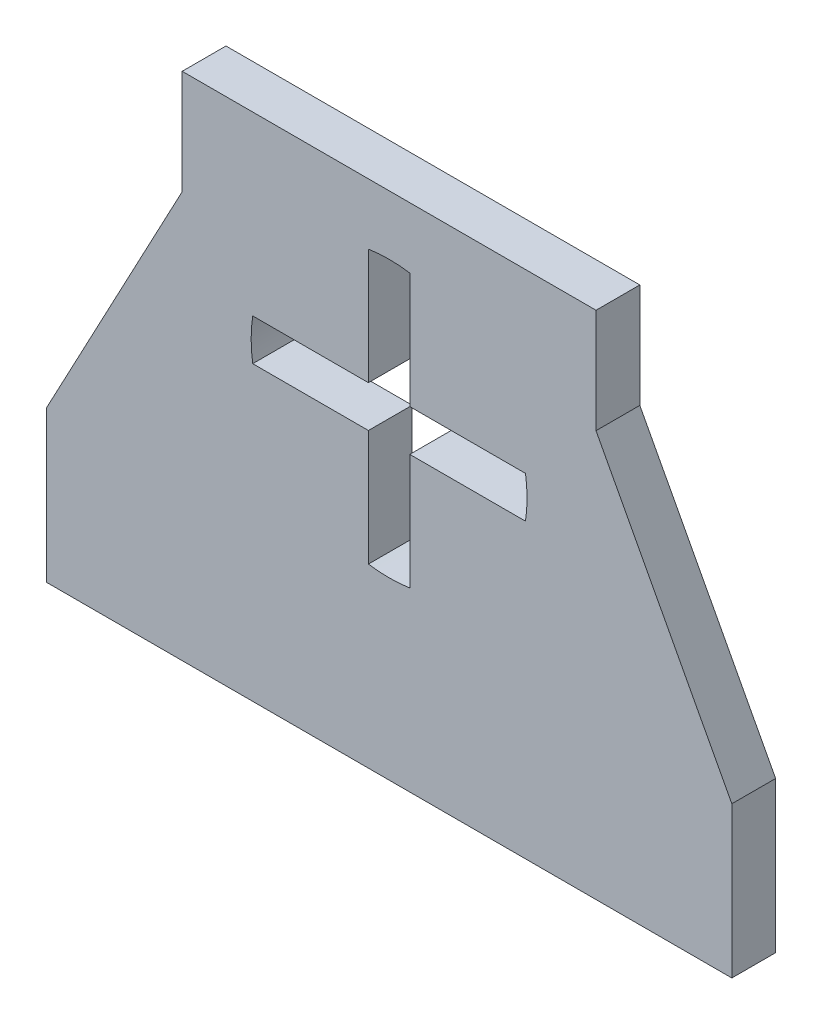
ISO-10303-21;
HEADER;
FILE_DESCRIPTION(('STEP AP214'),'2;1');
FILE_NAME('part.step','',(''),(''),'','','');
FILE_SCHEMA(('AUTOMOTIVE_DESIGN { 1 0 10303 214 1 1 1 1 }'));
ENDSEC;
DATA;
#1=APPLICATION_CONTEXT('core data for automotive mechanical design processes');
#2=APPLICATION_PROTOCOL_DEFINITION('international standard','automotive_design',2000,#1);
#3=PRODUCT_CONTEXT('',#1,'mechanical');
#4=PRODUCT('Part','Part','',(#3));
#5=PRODUCT_RELATED_PRODUCT_CATEGORY('part','',(#4));
#6=PRODUCT_DEFINITION_FORMATION('','',#4);
#7=PRODUCT_DEFINITION_CONTEXT('part definition',#1,'design');
#8=PRODUCT_DEFINITION('design','',#6,#7);
#9=PRODUCT_DEFINITION_SHAPE('','',#8);
#10=(LENGTH_UNIT() NAMED_UNIT(*) SI_UNIT(.MILLI.,.METRE.));
#11=(NAMED_UNIT(*) PLANE_ANGLE_UNIT() SI_UNIT($,.RADIAN.));
#12=(NAMED_UNIT(*) SI_UNIT($,.STERADIAN.) SOLID_ANGLE_UNIT());
#13=UNCERTAINTY_MEASURE_WITH_UNIT(LENGTH_MEASURE(1.E-05),#10,'distance_accuracy_value','');
#14=(GEOMETRIC_REPRESENTATION_CONTEXT(3) GLOBAL_UNCERTAINTY_ASSIGNED_CONTEXT((#13)) GLOBAL_UNIT_ASSIGNED_CONTEXT((#10,
#11,#12)) REPRESENTATION_CONTEXT('',''));
#15=CARTESIAN_POINT('',(0.,0.,0.));
#16=DIRECTION('',(0.,0.,1.));
#17=DIRECTION('',(1.,0.,0.));
#18=AXIS2_PLACEMENT_3D('',#15,#16,#17);
#19=CARTESIAN_POINT('',(0.,0.,3.175));
#20=DIRECTION('',(0.,0.,1.));
#21=DIRECTION('',(1.,0.,0.));
#22=AXIS2_PLACEMENT_3D('',#19,#20,#21);
#23=PLANE('',#22);
#24=DIRECTION('',(0.469783108849391,0.882781870361983,0.));
#25=VECTOR('',#24,1.);
#26=CARTESIAN_POINT('',(-18.2990938927911,9.73808537159615,3.175));
#27=LINE('',#26,#25);
#28=CARTESIAN_POINT('',(-24.845,-2.5625,3.175));
#29=VERTEX_POINT('',#28);
#30=CARTESIAN_POINT('',(-15.,15.9375,3.175));
#31=VERTEX_POINT('',#30);
#32=EDGE_CURVE('E139',#29,#31,#27,.T.);
#33=ORIENTED_EDGE('',*,*,#32,.F.);
#34=DIRECTION('',(0.,-1.,0.));
#35=VECTOR('',#34,1.);
#36=CARTESIAN_POINT('',(-24.845,13.5,3.175));
#37=LINE('',#36,#35);
#38=CARTESIAN_POINT('',(-24.845,-13.5,3.175));
#39=VERTEX_POINT('',#38);
#40=EDGE_CURVE('E169',#29,#39,#37,.T.);
#41=ORIENTED_EDGE('',*,*,#40,.T.);
#42=DIRECTION('',(1.,0.,0.));
#43=VECTOR('',#42,1.);
#44=CARTESIAN_POINT('',(-24.845,-13.5,3.175));
#45=LINE('',#44,#43);
#46=CARTESIAN_POINT('',(24.845,-13.5,3.175));
#47=VERTEX_POINT('',#46);
#48=EDGE_CURVE('E57',#39,#47,#45,.T.);
#49=ORIENTED_EDGE('',*,*,#48,.T.);
#50=DIRECTION('',(0.,1.,0.));
#51=VECTOR('',#50,1.);
#52=CARTESIAN_POINT('',(24.845,13.5,3.175));
#53=LINE('',#52,#51);
#54=CARTESIAN_POINT('',(24.845,-2.5625,3.175));
#55=VERTEX_POINT('',#54);
#56=EDGE_CURVE('E107',#47,#55,#53,.T.);
#57=ORIENTED_EDGE('',*,*,#56,.T.);
#58=DIRECTION('',(-0.469783108849391,0.882781870361983,0.));
#59=VECTOR('',#58,1.);
#60=CARTESIAN_POINT('',(18.2990938927911,9.73808537159615,3.175));
#61=LINE('',#60,#59);
#62=CARTESIAN_POINT('',(15.,15.9375,3.175));
#63=VERTEX_POINT('',#62);
#64=EDGE_CURVE('E75',#55,#63,#61,.T.);
#65=ORIENTED_EDGE('',*,*,#64,.T.);
#66=DIRECTION('',(0.,-1.,0.));
#67=VECTOR('',#66,1.);
#68=CARTESIAN_POINT('',(15.,0.,3.175));
#69=LINE('',#68,#67);
#70=CARTESIAN_POINT('',(15.,23.5,3.175));
#71=VERTEX_POINT('',#70);
#72=EDGE_CURVE('E142',#71,#63,#69,.T.);
#73=ORIENTED_EDGE('',*,*,#72,.F.);
#74=DIRECTION('',(1.,0.,0.));
#75=VECTOR('',#74,1.);
#76=CARTESIAN_POINT('',(0.,23.5,3.175));
#77=LINE('',#76,#75);
#78=CARTESIAN_POINT('',(-15.,23.5,3.175));
#79=VERTEX_POINT('',#78);
#80=EDGE_CURVE('E125',#79,#71,#77,.T.);
#81=ORIENTED_EDGE('',*,*,#80,.F.);
#82=DIRECTION('',(0.,-1.,0.));
#83=VECTOR('',#82,1.);
#84=CARTESIAN_POINT('',(-15.,0.,3.175));
#85=LINE('',#84,#83);
#86=EDGE_CURVE('E135',#79,#31,#85,.T.);
#87=ORIENTED_EDGE('',*,*,#86,.T.);
#88=EDGE_LOOP('',(#33,#41,#49,#57,#65,#73,#81,#87));
#89=FACE_BOUND('',#88,.T.);
#90=DIRECTION('',(1.,0.,0.));
#91=VECTOR('',#90,1.);
#92=CARTESIAN_POINT('',(0.,7.7,3.175));
#93=LINE('',#92,#91);
#94=CARTESIAN_POINT('',(-9.8868599666426,7.7,3.175));
#95=VERTEX_POINT('',#94);
#96=CARTESIAN_POINT('',(-1.5,7.7,3.175));
#97=VERTEX_POINT('',#96);
#98=EDGE_CURVE('E261',#95,#97,#93,.T.);
#99=ORIENTED_EDGE('',*,*,#98,.F.);
#100=CARTESIAN_POINT('',(0.,9.2,3.175));
#101=DIRECTION('',(0.,0.,-1.));
#102=DIRECTION('',(-1.,0.,0.));
#103=AXIS2_PLACEMENT_3D('',#100,#101,#102);
#104=CIRCLE('',#103,10.);
#105=CARTESIAN_POINT('',(-9.8868599666426,10.7,3.175));
#106=VERTEX_POINT('',#105);
#107=EDGE_CURVE('E151',#95,#106,#104,.T.);
#108=ORIENTED_EDGE('',*,*,#107,.T.);
#109=DIRECTION('',(1.,0.,0.));
#110=VECTOR('',#109,1.);
#111=CARTESIAN_POINT('',(0.,10.7,3.175));
#112=LINE('',#111,#110);
#113=CARTESIAN_POINT('',(-1.5,10.7,3.175));
#114=VERTEX_POINT('',#113);
#115=EDGE_CURVE('E202',#106,#114,#112,.T.);
#116=ORIENTED_EDGE('',*,*,#115,.T.);
#117=DIRECTION('',(0.,-1.,0.));
#118=VECTOR('',#117,1.);
#119=CARTESIAN_POINT('',(-1.5,0.,3.175));
#120=LINE('',#119,#118);
#121=CARTESIAN_POINT('',(-1.5,19.0868599666426,3.175));
#122=VERTEX_POINT('',#121);
#123=EDGE_CURVE('E237',#122,#114,#120,.T.);
#124=ORIENTED_EDGE('',*,*,#123,.F.);
#125=CARTESIAN_POINT('',(1.5,19.0868599666426,3.175));
#126=VERTEX_POINT('',#125);
#127=EDGE_CURVE('E194',#122,#126,#104,.T.);
#128=ORIENTED_EDGE('',*,*,#127,.T.);
#129=DIRECTION('',(0.,-1.,0.));
#130=VECTOR('',#129,1.);
#131=CARTESIAN_POINT('',(1.50000000000001,0.,3.175));
#132=LINE('',#131,#130);
#133=CARTESIAN_POINT('',(1.50000000000001,10.7,3.175));
#134=VERTEX_POINT('',#133);
#135=EDGE_CURVE('E276',#126,#134,#132,.T.);
#136=ORIENTED_EDGE('',*,*,#135,.T.);
#137=DIRECTION('',(-1.,0.,0.));
#138=VECTOR('',#137,1.);
#139=CARTESIAN_POINT('',(0.,10.7,3.175));
#140=LINE('',#139,#138);
#141=CARTESIAN_POINT('',(9.88685996664259,10.7,3.175));
#142=VERTEX_POINT('',#141);
#143=EDGE_CURVE('E273',#142,#134,#140,.T.);
#144=ORIENTED_EDGE('',*,*,#143,.F.);
#145=CARTESIAN_POINT('',(9.88685996664259,7.7,3.175));
#146=VERTEX_POINT('',#145);
#147=EDGE_CURVE('E197',#142,#146,#104,.T.);
#148=ORIENTED_EDGE('',*,*,#147,.T.);
#149=DIRECTION('',(-1.,0.,0.));
#150=VECTOR('',#149,1.);
#151=CARTESIAN_POINT('',(0.,7.7,3.175));
#152=LINE('',#151,#150);
#153=CARTESIAN_POINT('',(1.50000000000001,7.7,3.175));
#154=VERTEX_POINT('',#153);
#155=EDGE_CURVE('E270',#146,#154,#152,.T.);
#156=ORIENTED_EDGE('',*,*,#155,.T.);
#157=DIRECTION('',(0.,1.,0.));
#158=VECTOR('',#157,1.);
#159=CARTESIAN_POINT('',(1.50000000000001,0.,3.175));
#160=LINE('',#159,#158);
#161=CARTESIAN_POINT('',(1.50000000000001,-0.686859966642592,3.175));
#162=VERTEX_POINT('',#161);
#163=EDGE_CURVE('E267',#162,#154,#160,.T.);
#164=ORIENTED_EDGE('',*,*,#163,.F.);
#165=CARTESIAN_POINT('',(-1.5,-0.686859966642594,3.175));
#166=VERTEX_POINT('',#165);
#167=EDGE_CURVE('E301',#162,#166,#104,.T.);
#168=ORIENTED_EDGE('',*,*,#167,.T.);
#169=DIRECTION('',(0.,1.,0.));
#170=VECTOR('',#169,1.);
#171=CARTESIAN_POINT('',(-1.5,0.,3.175));
#172=LINE('',#171,#170);
#173=EDGE_CURVE('E264',#166,#97,#172,.T.);
#174=ORIENTED_EDGE('',*,*,#173,.T.);
#175=EDGE_LOOP('',(#99,#108,#116,#124,#128,#136,#144,#148,#156,#164,#168,#174));
#176=FACE_BOUND('',#175,.T.);
#177=ADVANCED_FACE('F40',(#89,#176),#23,.T.);
#178=CARTESIAN_POINT('',(0.,0.,0.));
#179=DIRECTION('',(0.,0.,1.));
#180=DIRECTION('',(1.,0.,0.));
#181=AXIS2_PLACEMENT_3D('',#178,#179,#180);
#182=PLANE('',#181);
#183=DIRECTION('',(0.,-1.,0.));
#184=VECTOR('',#183,1.);
#185=CARTESIAN_POINT('',(-24.845,13.5,0.));
#186=LINE('',#185,#184);
#187=CARTESIAN_POINT('',(-24.845,-2.5625,0.));
#188=VERTEX_POINT('',#187);
#189=CARTESIAN_POINT('',(-24.845,-13.5,0.));
#190=VERTEX_POINT('',#189);
#191=EDGE_CURVE('E68',#188,#190,#186,.T.);
#192=ORIENTED_EDGE('',*,*,#191,.F.);
#193=DIRECTION('',(0.469783108849391,0.882781870361983,0.));
#194=VECTOR('',#193,1.);
#195=CARTESIAN_POINT('',(-18.2990938927911,9.73808537159615,0.));
#196=LINE('',#195,#194);
#197=CARTESIAN_POINT('',(-15.,15.9375,0.));
#198=VERTEX_POINT('',#197);
#199=EDGE_CURVE('E150',#188,#198,#196,.T.);
#200=ORIENTED_EDGE('',*,*,#199,.T.);
#201=DIRECTION('',(0.,-1.,0.));
#202=VECTOR('',#201,1.);
#203=CARTESIAN_POINT('',(-15.,0.,0.));
#204=LINE('',#203,#202);
#205=CARTESIAN_POINT('',(-15.,23.5,0.));
#206=VERTEX_POINT('',#205);
#207=EDGE_CURVE('E154',#206,#198,#204,.T.);
#208=ORIENTED_EDGE('',*,*,#207,.F.);
#209=DIRECTION('',(1.,0.,0.));
#210=VECTOR('',#209,1.);
#211=CARTESIAN_POINT('',(0.,23.5,0.));
#212=LINE('',#211,#210);
#213=CARTESIAN_POINT('',(15.,23.5,0.));
#214=VERTEX_POINT('',#213);
#215=EDGE_CURVE('E127',#206,#214,#212,.T.);
#216=ORIENTED_EDGE('',*,*,#215,.T.);
#217=DIRECTION('',(0.,-1.,0.));
#218=VECTOR('',#217,1.);
#219=CARTESIAN_POINT('',(15.,0.,0.));
#220=LINE('',#219,#218);
#221=CARTESIAN_POINT('',(15.,15.9375,0.));
#222=VERTEX_POINT('',#221);
#223=EDGE_CURVE('E157',#214,#222,#220,.T.);
#224=ORIENTED_EDGE('',*,*,#223,.T.);
#225=DIRECTION('',(-0.469783108849391,0.882781870361983,0.));
#226=VECTOR('',#225,1.);
#227=CARTESIAN_POINT('',(18.2990938927911,9.73808537159615,0.));
#228=LINE('',#227,#226);
#229=CARTESIAN_POINT('',(24.845,-2.5625,0.));
#230=VERTEX_POINT('',#229);
#231=EDGE_CURVE('E148',#230,#222,#228,.T.);
#232=ORIENTED_EDGE('',*,*,#231,.F.);
#233=DIRECTION('',(0.,1.,0.));
#234=VECTOR('',#233,1.);
#235=CARTESIAN_POINT('',(24.845,13.5,0.));
#236=LINE('',#235,#234);
#237=CARTESIAN_POINT('',(24.845,-13.5,0.));
#238=VERTEX_POINT('',#237);
#239=EDGE_CURVE('E161',#238,#230,#236,.T.);
#240=ORIENTED_EDGE('',*,*,#239,.F.);
#241=DIRECTION('',(1.,0.,0.));
#242=VECTOR('',#241,1.);
#243=CARTESIAN_POINT('',(-24.845,-13.5,0.));
#244=LINE('',#243,#242);
#245=EDGE_CURVE('E170',#190,#238,#244,.T.);
#246=ORIENTED_EDGE('',*,*,#245,.F.);
#247=EDGE_LOOP('',(#192,#200,#208,#216,#224,#232,#240,#246));
#248=FACE_BOUND('',#247,.T.);
#249=CARTESIAN_POINT('',(0.,9.2,0.));
#250=DIRECTION('',(0.,0.,-1.));
#251=DIRECTION('',(-1.,0.,0.));
#252=AXIS2_PLACEMENT_3D('',#249,#250,#251);
#253=CIRCLE('',#252,10.);
#254=CARTESIAN_POINT('',(-9.8868599666426,7.7,0.));
#255=VERTEX_POINT('',#254);
#256=CARTESIAN_POINT('',(-9.8868599666426,10.7,0.));
#257=VERTEX_POINT('',#256);
#258=EDGE_CURVE('E193',#255,#257,#253,.T.);
#259=ORIENTED_EDGE('',*,*,#258,.F.);
#260=DIRECTION('',(1.,0.,0.));
#261=VECTOR('',#260,1.);
#262=CARTESIAN_POINT('',(0.,7.7,0.));
#263=LINE('',#262,#261);
#264=CARTESIAN_POINT('',(-1.5,7.7,0.));
#265=VERTEX_POINT('',#264);
#266=EDGE_CURVE('E238',#255,#265,#263,.T.);
#267=ORIENTED_EDGE('',*,*,#266,.T.);
#268=DIRECTION('',(0.,1.,0.));
#269=VECTOR('',#268,1.);
#270=CARTESIAN_POINT('',(-1.5,0.,0.));
#271=LINE('',#270,#269);
#272=CARTESIAN_POINT('',(-1.5,-0.686859966642594,0.));
#273=VERTEX_POINT('',#272);
#274=EDGE_CURVE('E241',#273,#265,#271,.T.);
#275=ORIENTED_EDGE('',*,*,#274,.F.);
#276=CARTESIAN_POINT('',(1.50000000000001,-0.686859966642592,0.));
#277=VERTEX_POINT('',#276);
#278=EDGE_CURVE('E342',#277,#273,#253,.T.);
#279=ORIENTED_EDGE('',*,*,#278,.F.);
#280=DIRECTION('',(0.,1.,0.));
#281=VECTOR('',#280,1.);
#282=CARTESIAN_POINT('',(1.50000000000001,0.,0.));
#283=LINE('',#282,#281);
#284=CARTESIAN_POINT('',(1.50000000000001,7.7,0.));
#285=VERTEX_POINT('',#284);
#286=EDGE_CURVE('E244',#277,#285,#283,.T.);
#287=ORIENTED_EDGE('',*,*,#286,.T.);
#288=DIRECTION('',(-1.,0.,0.));
#289=VECTOR('',#288,1.);
#290=CARTESIAN_POINT('',(0.,7.7,0.));
#291=LINE('',#290,#289);
#292=CARTESIAN_POINT('',(9.88685996664259,7.7,0.));
#293=VERTEX_POINT('',#292);
#294=EDGE_CURVE('E247',#293,#285,#291,.T.);
#295=ORIENTED_EDGE('',*,*,#294,.F.);
#296=CARTESIAN_POINT('',(9.88685996664259,10.7,0.));
#297=VERTEX_POINT('',#296);
#298=EDGE_CURVE('E191',#297,#293,#253,.T.);
#299=ORIENTED_EDGE('',*,*,#298,.F.);
#300=DIRECTION('',(-1.,0.,0.));
#301=VECTOR('',#300,1.);
#302=CARTESIAN_POINT('',(0.,10.7,0.));
#303=LINE('',#302,#301);
#304=CARTESIAN_POINT('',(1.50000000000001,10.7,0.));
#305=VERTEX_POINT('',#304);
#306=EDGE_CURVE('E250',#297,#305,#303,.T.);
#307=ORIENTED_EDGE('',*,*,#306,.T.);
#308=DIRECTION('',(0.,-1.,0.));
#309=VECTOR('',#308,1.);
#310=CARTESIAN_POINT('',(1.50000000000001,0.,0.));
#311=LINE('',#310,#309);
#312=CARTESIAN_POINT('',(1.5,19.0868599666426,0.));
#313=VERTEX_POINT('',#312);
#314=EDGE_CURVE('E253',#313,#305,#311,.T.);
#315=ORIENTED_EDGE('',*,*,#314,.F.);
#316=CARTESIAN_POINT('',(-1.5,19.0868599666426,0.));
#317=VERTEX_POINT('',#316);
#318=EDGE_CURVE('E188',#317,#313,#253,.T.);
#319=ORIENTED_EDGE('',*,*,#318,.F.);
#320=DIRECTION('',(0.,-1.,0.));
#321=VECTOR('',#320,1.);
#322=CARTESIAN_POINT('',(-1.5,0.,0.));
#323=LINE('',#322,#321);
#324=CARTESIAN_POINT('',(-1.5,10.7,0.));
#325=VERTEX_POINT('',#324);
#326=EDGE_CURVE('E256',#317,#325,#323,.T.);
#327=ORIENTED_EDGE('',*,*,#326,.T.);
#328=DIRECTION('',(1.,0.,0.));
#329=VECTOR('',#328,1.);
#330=CARTESIAN_POINT('',(0.,10.7,0.));
#331=LINE('',#330,#329);
#332=EDGE_CURVE('E234',#257,#325,#331,.T.);
#333=ORIENTED_EDGE('',*,*,#332,.F.);
#334=EDGE_LOOP('',(#259,#267,#275,#279,#287,#295,#299,#307,#315,#319,#327,#333));
#335=FACE_BOUND('',#334,.T.);
#336=ADVANCED_FACE('F182',(#248,#335),#182,.F.);
#337=CARTESIAN_POINT('',(24.845,13.5,3.175));
#338=DIRECTION('',(-1.,0.,0.));
#339=DIRECTION('',(0.,0.,1.));
#340=AXIS2_PLACEMENT_3D('',#337,#338,#339);
#341=PLANE('',#340);
#342=ORIENTED_EDGE('',*,*,#239,.T.);
#343=DIRECTION('',(0.,0.,-1.));
#344=VECTOR('',#343,1.);
#345=CARTESIAN_POINT('',(24.845,-2.5625,3.175));
#346=LINE('',#345,#344);
#347=EDGE_CURVE('E144',#55,#230,#346,.T.);
#348=ORIENTED_EDGE('',*,*,#347,.F.);
#349=ORIENTED_EDGE('',*,*,#56,.F.);
#350=DIRECTION('',(0.,0.,-1.));
#351=VECTOR('',#350,1.);
#352=CARTESIAN_POINT('',(24.845,-13.5,3.175));
#353=LINE('',#352,#351);
#354=EDGE_CURVE('E49',#47,#238,#353,.T.);
#355=ORIENTED_EDGE('',*,*,#354,.T.);
#356=EDGE_LOOP('',(#342,#348,#349,#355));
#357=FACE_BOUND('',#356,.T.);
#358=ADVANCED_FACE('F42',(#357),#341,.F.);
#359=CARTESIAN_POINT('',(-24.845,13.5,3.175));
#360=DIRECTION('',(1.,0.,0.));
#361=DIRECTION('',(0.,0.,-1.));
#362=AXIS2_PLACEMENT_3D('',#359,#360,#361);
#363=PLANE('',#362);
#364=ORIENTED_EDGE('',*,*,#40,.F.);
#365=DIRECTION('',(0.,0.,-1.));
#366=VECTOR('',#365,1.);
#367=CARTESIAN_POINT('',(-24.845,-2.5625,3.175));
#368=LINE('',#367,#366);
#369=EDGE_CURVE('E164',#29,#188,#368,.T.);
#370=ORIENTED_EDGE('',*,*,#369,.T.);
#371=ORIENTED_EDGE('',*,*,#191,.T.);
#372=DIRECTION('',(0.,0.,-1.));
#373=VECTOR('',#372,1.);
#374=CARTESIAN_POINT('',(-24.845,-13.5,3.175));
#375=LINE('',#374,#373);
#376=EDGE_CURVE('E11',#39,#190,#375,.T.);
#377=ORIENTED_EDGE('',*,*,#376,.F.);
#378=EDGE_LOOP('',(#364,#370,#371,#377));
#379=FACE_BOUND('',#378,.T.);
#380=ADVANCED_FACE('F414',(#379),#363,.F.);
#381=CARTESIAN_POINT('',(-24.845,-13.5,3.175));
#382=DIRECTION('',(0.,1.,0.));
#383=DIRECTION('',(0.,0.,1.));
#384=AXIS2_PLACEMENT_3D('',#381,#382,#383);
#385=PLANE('',#384);
#386=ORIENTED_EDGE('',*,*,#245,.T.);
#387=ORIENTED_EDGE('',*,*,#354,.F.);
#388=ORIENTED_EDGE('',*,*,#48,.F.);
#389=ORIENTED_EDGE('',*,*,#376,.T.);
#390=EDGE_LOOP('',(#386,#387,#388,#389));
#391=FACE_BOUND('',#390,.T.);
#392=ADVANCED_FACE('F412',(#391),#385,.F.);
#393=CARTESIAN_POINT('',(18.2990938927911,9.73808537159615,3.175));
#394=DIRECTION('',(-0.882781870361983,-0.469783108849391,0.));
#395=DIRECTION('',(0.469783108849391,-0.882781870361983,0.));
#396=AXIS2_PLACEMENT_3D('',#393,#394,#395);
#397=PLANE('',#396);
#398=ORIENTED_EDGE('',*,*,#231,.T.);
#399=DIRECTION('',(0.,0.,-1.));
#400=VECTOR('',#399,1.);
#401=CARTESIAN_POINT('',(15.,15.9375,3.175));
#402=LINE('',#401,#400);
#403=EDGE_CURVE('E102',#63,#222,#402,.T.);
#404=ORIENTED_EDGE('',*,*,#403,.F.);
#405=ORIENTED_EDGE('',*,*,#64,.F.);
#406=ORIENTED_EDGE('',*,*,#347,.T.);
#407=EDGE_LOOP('',(#398,#404,#405,#406));
#408=FACE_BOUND('',#407,.T.);
#409=ADVANCED_FACE('F185',(#408),#397,.F.);
#410=CARTESIAN_POINT('',(15.,0.,3.175));
#411=DIRECTION('',(1.,0.,0.));
#412=DIRECTION('',(0.,0.,-1.));
#413=AXIS2_PLACEMENT_3D('',#410,#411,#412);
#414=PLANE('',#413);
#415=ORIENTED_EDGE('',*,*,#223,.F.);
#416=DIRECTION('',(0.,0.,-1.));
#417=VECTOR('',#416,1.);
#418=CARTESIAN_POINT('',(15.,23.5,3.175));
#419=LINE('',#418,#417);
#420=EDGE_CURVE('E131',#71,#214,#419,.T.);
#421=ORIENTED_EDGE('',*,*,#420,.F.);
#422=ORIENTED_EDGE('',*,*,#72,.T.);
#423=ORIENTED_EDGE('',*,*,#403,.T.);
#424=EDGE_LOOP('',(#415,#421,#422,#423));
#425=FACE_BOUND('',#424,.T.);
#426=ADVANCED_FACE('F422',(#425),#414,.T.);
#427=CARTESIAN_POINT('',(0.,23.5,3.175));
#428=DIRECTION('',(0.,1.,0.));
#429=DIRECTION('',(0.,0.,1.));
#430=AXIS2_PLACEMENT_3D('',#427,#428,#429);
#431=PLANE('',#430);
#432=ORIENTED_EDGE('',*,*,#215,.F.);
#433=DIRECTION('',(0.,0.,-1.));
#434=VECTOR('',#433,1.);
#435=CARTESIAN_POINT('',(-15.,23.5,3.175));
#436=LINE('',#435,#434);
#437=EDGE_CURVE('E121',#79,#206,#436,.T.);
#438=ORIENTED_EDGE('',*,*,#437,.F.);
#439=ORIENTED_EDGE('',*,*,#80,.T.);
#440=ORIENTED_EDGE('',*,*,#420,.T.);
#441=EDGE_LOOP('',(#432,#438,#439,#440));
#442=FACE_BOUND('',#441,.T.);
#443=ADVANCED_FACE('F123',(#442),#431,.T.);
#444=CARTESIAN_POINT('',(-15.,0.,3.175));
#445=DIRECTION('',(1.,0.,0.));
#446=DIRECTION('',(0.,0.,-1.));
#447=AXIS2_PLACEMENT_3D('',#444,#445,#446);
#448=PLANE('',#447);
#449=ORIENTED_EDGE('',*,*,#207,.T.);
#450=DIRECTION('',(0.,0.,-1.));
#451=VECTOR('',#450,1.);
#452=CARTESIAN_POINT('',(-15.,15.9375,3.175));
#453=LINE('',#452,#451);
#454=EDGE_CURVE('E132',#31,#198,#453,.T.);
#455=ORIENTED_EDGE('',*,*,#454,.F.);
#456=ORIENTED_EDGE('',*,*,#86,.F.);
#457=ORIENTED_EDGE('',*,*,#437,.T.);
#458=EDGE_LOOP('',(#449,#455,#456,#457));
#459=FACE_BOUND('',#458,.T.);
#460=ADVANCED_FACE('F136',(#459),#448,.F.);
#461=CARTESIAN_POINT('',(-18.2990938927911,9.73808537159615,3.175));
#462=DIRECTION('',(-0.882781870361983,0.469783108849391,0.));
#463=DIRECTION('',(-0.469783108849391,-0.882781870361983,0.));
#464=AXIS2_PLACEMENT_3D('',#461,#462,#463);
#465=PLANE('',#464);
#466=ORIENTED_EDGE('',*,*,#199,.F.);
#467=ORIENTED_EDGE('',*,*,#369,.F.);
#468=ORIENTED_EDGE('',*,*,#32,.T.);
#469=ORIENTED_EDGE('',*,*,#454,.T.);
#470=EDGE_LOOP('',(#466,#467,#468,#469));
#471=FACE_BOUND('',#470,.T.);
#472=ADVANCED_FACE('F402',(#471),#465,.T.);
#473=CARTESIAN_POINT('',(0.,9.2,3.175));
#474=DIRECTION('',(0.,0.,-1.));
#475=DIRECTION('',(-1.,0.,0.));
#476=AXIS2_PLACEMENT_3D('',#473,#474,#475);
#477=CYLINDRICAL_SURFACE('',#476,10.);
#478=ORIENTED_EDGE('',*,*,#258,.T.);
#479=DIRECTION('',(0.,0.,-1.));
#480=VECTOR('',#479,1.);
#481=CARTESIAN_POINT('',(-9.8868599666426,10.7,3.175));
#482=LINE('',#481,#480);
#483=EDGE_CURVE('E229',#106,#257,#482,.T.);
#484=ORIENTED_EDGE('',*,*,#483,.F.);
#485=ORIENTED_EDGE('',*,*,#107,.F.);
#486=DIRECTION('',(0.,0.,-1.));
#487=VECTOR('',#486,1.);
#488=CARTESIAN_POINT('',(-9.8868599666426,7.7,3.175));
#489=LINE('',#488,#487);
#490=EDGE_CURVE('E226',#95,#255,#489,.T.);
#491=ORIENTED_EDGE('',*,*,#490,.T.);
#492=EDGE_LOOP('',(#478,#484,#485,#491));
#493=FACE_BOUND('',#492,.T.);
#494=ADVANCED_FACE('F303',(#493),#477,.F.);
#495=ORIENTED_EDGE('',*,*,#278,.T.);
#496=DIRECTION('',(0.,0.,-1.));
#497=VECTOR('',#496,1.);
#498=CARTESIAN_POINT('',(-1.5,-0.686859966642594,3.175));
#499=LINE('',#498,#497);
#500=EDGE_CURVE('E220',#166,#273,#499,.T.);
#501=ORIENTED_EDGE('',*,*,#500,.F.);
#502=ORIENTED_EDGE('',*,*,#167,.F.);
#503=DIRECTION('',(0.,0.,-1.));
#504=VECTOR('',#503,1.);
#505=CARTESIAN_POINT('',(1.50000000000001,-0.686859966642592,3.175));
#506=LINE('',#505,#504);
#507=EDGE_CURVE('E217',#162,#277,#506,.T.);
#508=ORIENTED_EDGE('',*,*,#507,.T.);
#509=EDGE_LOOP('',(#495,#501,#502,#508));
#510=FACE_BOUND('',#509,.T.);
#511=ADVANCED_FACE('F348',(#510),#477,.F.);
#512=ORIENTED_EDGE('',*,*,#298,.T.);
#513=DIRECTION('',(0.,0.,-1.));
#514=VECTOR('',#513,1.);
#515=CARTESIAN_POINT('',(9.88685996664259,7.7,3.175));
#516=LINE('',#515,#514);
#517=EDGE_CURVE('E211',#146,#293,#516,.T.);
#518=ORIENTED_EDGE('',*,*,#517,.F.);
#519=ORIENTED_EDGE('',*,*,#147,.F.);
#520=DIRECTION('',(0.,0.,-1.));
#521=VECTOR('',#520,1.);
#522=CARTESIAN_POINT('',(9.88685996664259,10.7,3.175));
#523=LINE('',#522,#521);
#524=EDGE_CURVE('E208',#142,#297,#523,.T.);
#525=ORIENTED_EDGE('',*,*,#524,.T.);
#526=EDGE_LOOP('',(#512,#518,#519,#525));
#527=FACE_BOUND('',#526,.T.);
#528=ADVANCED_FACE('F364',(#527),#477,.F.);
#529=ORIENTED_EDGE('',*,*,#318,.T.);
#530=DIRECTION('',(0.,0.,-1.));
#531=VECTOR('',#530,1.);
#532=CARTESIAN_POINT('',(1.5,19.0868599666426,3.175));
#533=LINE('',#532,#531);
#534=EDGE_CURVE('E201',#126,#313,#533,.T.);
#535=ORIENTED_EDGE('',*,*,#534,.F.);
#536=ORIENTED_EDGE('',*,*,#127,.F.);
#537=DIRECTION('',(0.,0.,-1.));
#538=VECTOR('',#537,1.);
#539=CARTESIAN_POINT('',(-1.5,19.0868599666426,3.175));
#540=LINE('',#539,#538);
#541=EDGE_CURVE('E198',#122,#317,#540,.T.);
#542=ORIENTED_EDGE('',*,*,#541,.T.);
#543=EDGE_LOOP('',(#529,#535,#536,#542));
#544=FACE_BOUND('',#543,.T.);
#545=ADVANCED_FACE('F379',(#544),#477,.F.);
#546=CARTESIAN_POINT('',(1.50000000000001,0.,3.175));
#547=DIRECTION('',(1.,0.,0.));
#548=DIRECTION('',(0.,1.,0.));
#549=AXIS2_PLACEMENT_3D('',#546,#547,#548);
#550=PLANE('',#549);
#551=ORIENTED_EDGE('',*,*,#314,.T.);
#552=DIRECTION('',(0.,0.,-1.));
#553=VECTOR('',#552,1.);
#554=CARTESIAN_POINT('',(1.50000000000001,10.7,3.175));
#555=LINE('',#554,#553);
#556=EDGE_CURVE('E205',#134,#305,#555,.T.);
#557=ORIENTED_EDGE('',*,*,#556,.F.);
#558=ORIENTED_EDGE('',*,*,#135,.F.);
#559=ORIENTED_EDGE('',*,*,#534,.T.);
#560=EDGE_LOOP('',(#551,#557,#558,#559));
#561=FACE_BOUND('',#560,.T.);
#562=ADVANCED_FACE('F374',(#561),#550,.F.);
#563=CARTESIAN_POINT('',(0.,10.7,3.175));
#564=DIRECTION('',(0.,-1.,0.));
#565=DIRECTION('',(0.,0.,-1.));
#566=AXIS2_PLACEMENT_3D('',#563,#564,#565);
#567=PLANE('',#566);
#568=ORIENTED_EDGE('',*,*,#306,.F.);
#569=ORIENTED_EDGE('',*,*,#524,.F.);
#570=ORIENTED_EDGE('',*,*,#143,.T.);
#571=ORIENTED_EDGE('',*,*,#556,.T.);
#572=EDGE_LOOP('',(#568,#569,#570,#571));
#573=FACE_BOUND('',#572,.T.);
#574=ADVANCED_FACE('F369',(#573),#567,.T.);
#575=CARTESIAN_POINT('',(0.,7.7,3.175));
#576=DIRECTION('',(0.,-1.,0.));
#577=DIRECTION('',(0.,0.,-1.));
#578=AXIS2_PLACEMENT_3D('',#575,#576,#577);
#579=PLANE('',#578);
#580=ORIENTED_EDGE('',*,*,#294,.T.);
#581=DIRECTION('',(0.,0.,-1.));
#582=VECTOR('',#581,1.);
#583=CARTESIAN_POINT('',(1.50000000000001,7.7,3.175));
#584=LINE('',#583,#582);
#585=EDGE_CURVE('E214',#154,#285,#584,.T.);
#586=ORIENTED_EDGE('',*,*,#585,.F.);
#587=ORIENTED_EDGE('',*,*,#155,.F.);
#588=ORIENTED_EDGE('',*,*,#517,.T.);
#589=EDGE_LOOP('',(#580,#586,#587,#588));
#590=FACE_BOUND('',#589,.T.);
#591=ADVANCED_FACE('F358',(#590),#579,.F.);
#592=CARTESIAN_POINT('',(1.50000000000001,0.,3.175));
#593=DIRECTION('',(-1.,0.,0.));
#594=DIRECTION('',(0.,-1.,0.));
#595=AXIS2_PLACEMENT_3D('',#592,#593,#594);
#596=PLANE('',#595);
#597=ORIENTED_EDGE('',*,*,#286,.F.);
#598=ORIENTED_EDGE('',*,*,#507,.F.);
#599=ORIENTED_EDGE('',*,*,#163,.T.);
#600=ORIENTED_EDGE('',*,*,#585,.T.);
#601=EDGE_LOOP('',(#597,#598,#599,#600));
#602=FACE_BOUND('',#601,.T.);
#603=ADVANCED_FACE('F353',(#602),#596,.T.);
#604=CARTESIAN_POINT('',(-1.5,0.,3.175));
#605=DIRECTION('',(-1.,0.,0.));
#606=DIRECTION('',(0.,-1.,0.));
#607=AXIS2_PLACEMENT_3D('',#604,#605,#606);
#608=PLANE('',#607);
#609=ORIENTED_EDGE('',*,*,#274,.T.);
#610=DIRECTION('',(0.,0.,-1.));
#611=VECTOR('',#610,1.);
#612=CARTESIAN_POINT('',(-1.5,7.7,3.175));
#613=LINE('',#612,#611);
#614=EDGE_CURVE('E223',#97,#265,#613,.T.);
#615=ORIENTED_EDGE('',*,*,#614,.F.);
#616=ORIENTED_EDGE('',*,*,#173,.F.);
#617=ORIENTED_EDGE('',*,*,#500,.T.);
#618=EDGE_LOOP('',(#609,#615,#616,#617));
#619=FACE_BOUND('',#618,.T.);
#620=ADVANCED_FACE('F340',(#619),#608,.F.);
#621=CARTESIAN_POINT('',(0.,7.7,3.175));
#622=DIRECTION('',(0.,1.,0.));
#623=DIRECTION('',(0.,0.,1.));
#624=AXIS2_PLACEMENT_3D('',#621,#622,#623);
#625=PLANE('',#624);
#626=ORIENTED_EDGE('',*,*,#266,.F.);
#627=ORIENTED_EDGE('',*,*,#490,.F.);
#628=ORIENTED_EDGE('',*,*,#98,.T.);
#629=ORIENTED_EDGE('',*,*,#614,.T.);
#630=EDGE_LOOP('',(#626,#627,#628,#629));
#631=FACE_BOUND('',#630,.T.);
#632=ADVANCED_FACE('F335',(#631),#625,.T.);
#633=CARTESIAN_POINT('',(-1.5,0.,3.175));
#634=DIRECTION('',(1.,0.,0.));
#635=DIRECTION('',(0.,1.,0.));
#636=AXIS2_PLACEMENT_3D('',#633,#634,#635);
#637=PLANE('',#636);
#638=ORIENTED_EDGE('',*,*,#326,.F.);
#639=ORIENTED_EDGE('',*,*,#541,.F.);
#640=ORIENTED_EDGE('',*,*,#123,.T.);
#641=DIRECTION('',(0.,0.,-1.));
#642=VECTOR('',#641,1.);
#643=CARTESIAN_POINT('',(-1.5,10.7,3.175));
#644=LINE('',#643,#642);
#645=EDGE_CURVE('E192',#114,#325,#644,.T.);
#646=ORIENTED_EDGE('',*,*,#645,.T.);
#647=EDGE_LOOP('',(#638,#639,#640,#646));
#648=FACE_BOUND('',#647,.T.);
#649=ADVANCED_FACE('F285',(#648),#637,.T.);
#650=CARTESIAN_POINT('',(0.,10.7,3.175));
#651=DIRECTION('',(0.,1.,0.));
#652=DIRECTION('',(0.,0.,1.));
#653=AXIS2_PLACEMENT_3D('',#650,#651,#652);
#654=PLANE('',#653);
#655=ORIENTED_EDGE('',*,*,#332,.T.);
#656=ORIENTED_EDGE('',*,*,#645,.F.);
#657=ORIENTED_EDGE('',*,*,#115,.F.);
#658=ORIENTED_EDGE('',*,*,#483,.T.);
#659=EDGE_LOOP('',(#655,#656,#657,#658));
#660=FACE_BOUND('',#659,.T.);
#661=ADVANCED_FACE('F291',(#660),#654,.F.);
#662=CLOSED_SHELL('',(#177,#336,#358,#380,#392,#409,#426,#443,#460,#472,#494,#511,#528,#545,
#562,#574,#591,#603,#620,#632,#649,#661));
#663=MANIFOLD_SOLID_BREP('B2',#662);
#664=ADVANCED_BREP_SHAPE_REPRESENTATION('',(#18,#663),#14);
#665=SHAPE_DEFINITION_REPRESENTATION(#9,#664);
ENDSEC;
END-ISO-10303-21;
